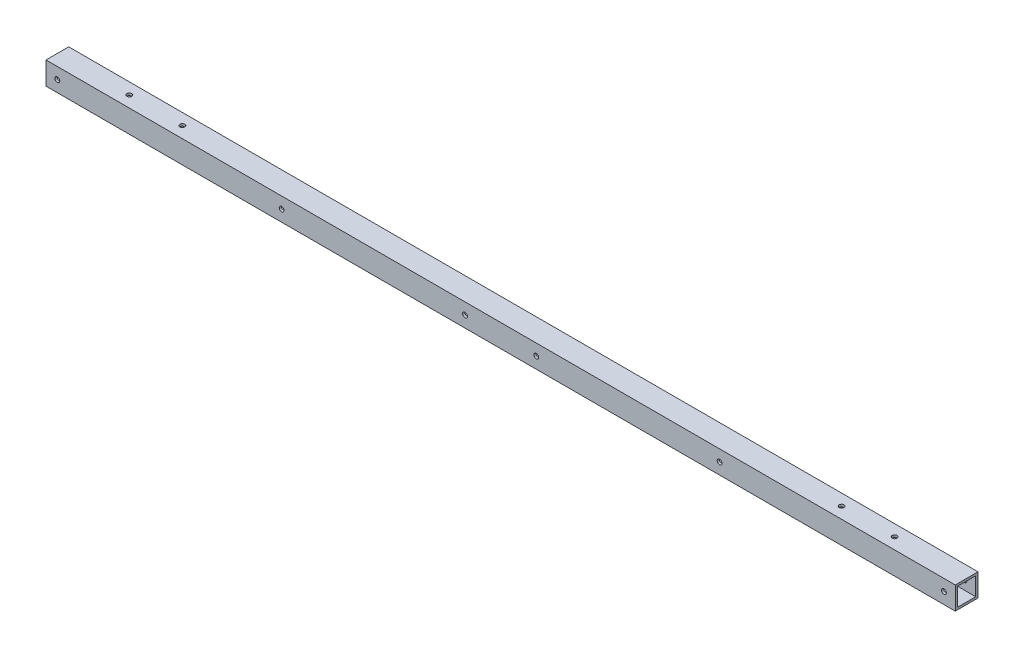
ISO-10303-21;
HEADER;
FILE_DESCRIPTION(('STEP AP214'),'2;1');
FILE_NAME('part.step','',(''),(''),'','','');
FILE_SCHEMA(('AUTOMOTIVE_DESIGN { 1 0 10303 214 1 1 1 1 }'));
ENDSEC;
DATA;
#1=APPLICATION_CONTEXT('core data for automotive mechanical design processes');
#2=APPLICATION_PROTOCOL_DEFINITION('international standard','automotive_design',2000,#1);
#3=PRODUCT_CONTEXT('',#1,'mechanical');
#4=PRODUCT('Part','Part','',(#3));
#5=PRODUCT_RELATED_PRODUCT_CATEGORY('part','',(#4));
#6=PRODUCT_DEFINITION_FORMATION('','',#4);
#7=PRODUCT_DEFINITION_CONTEXT('part definition',#1,'design');
#8=PRODUCT_DEFINITION('design','',#6,#7);
#9=PRODUCT_DEFINITION_SHAPE('','',#8);
#10=(LENGTH_UNIT() NAMED_UNIT(*) SI_UNIT(.MILLI.,.METRE.));
#11=(NAMED_UNIT(*) PLANE_ANGLE_UNIT() SI_UNIT($,.RADIAN.));
#12=(NAMED_UNIT(*) SI_UNIT($,.STERADIAN.) SOLID_ANGLE_UNIT());
#13=UNCERTAINTY_MEASURE_WITH_UNIT(LENGTH_MEASURE(1.E-05),#10,'distance_accuracy_value','');
#14=(GEOMETRIC_REPRESENTATION_CONTEXT(3) GLOBAL_UNCERTAINTY_ASSIGNED_CONTEXT((#13)) GLOBAL_UNIT_ASSIGNED_CONTEXT((#10,
#11,#12)) REPRESENTATION_CONTEXT('',''));
#15=CARTESIAN_POINT('',(0.,0.,0.));
#16=DIRECTION('',(0.,0.,1.));
#17=DIRECTION('',(1.,0.,0.));
#18=AXIS2_PLACEMENT_3D('',#15,#16,#17);
#19=CARTESIAN_POINT('',(7.5,-7.5,15.));
#20=DIRECTION('',(0.,0.,-1.));
#21=DIRECTION('',(-1.,0.,0.));
#22=AXIS2_PLACEMENT_3D('',#19,#20,#21);
#23=CYLINDRICAL_SURFACE('',#22,1.6);
#24=CARTESIAN_POINT('',(7.5,-7.5,13.5));
#25=DIRECTION('',(0.,0.,1.));
#26=DIRECTION('',(1.,0.,0.));
#27=AXIS2_PLACEMENT_3D('',#24,#25,#26);
#28=CIRCLE('',#27,1.6);
#29=CARTESIAN_POINT('',(9.1,-7.5,13.5));
#30=VERTEX_POINT('',#29);
#31=EDGE_CURVE('E165',#30,#30,#28,.T.);
#32=ORIENTED_EDGE('',*,*,#31,.F.);
#33=EDGE_LOOP('',(#32));
#34=FACE_BOUND('',#33,.T.);
#35=CARTESIAN_POINT('',(7.5,-7.5,15.));
#36=DIRECTION('',(0.,0.,1.));
#37=DIRECTION('',(1.,0.,0.));
#38=AXIS2_PLACEMENT_3D('',#35,#36,#37);
#39=CIRCLE('',#38,1.6);
#40=CARTESIAN_POINT('',(9.1,-7.5,15.));
#41=VERTEX_POINT('',#40);
#42=EDGE_CURVE('E187',#41,#41,#39,.T.);
#43=ORIENTED_EDGE('',*,*,#42,.T.);
#44=EDGE_LOOP('',(#43));
#45=FACE_BOUND('',#44,.T.);
#46=ADVANCED_FACE('F43',(#34,#45),#23,.F.);
#47=CARTESIAN_POINT('',(155.5,-7.5,15.));
#48=DIRECTION('',(0.,0.,-1.));
#49=DIRECTION('',(-1.,0.,0.));
#50=AXIS2_PLACEMENT_3D('',#47,#48,#49);
#51=CYLINDRICAL_SURFACE('',#50,1.59999999999999);
#52=CARTESIAN_POINT('',(155.5,-7.5,13.5));
#53=DIRECTION('',(0.,0.,1.));
#54=DIRECTION('',(1.,0.,0.));
#55=AXIS2_PLACEMENT_3D('',#52,#53,#54);
#56=CIRCLE('',#55,1.59999999999999);
#57=CARTESIAN_POINT('',(157.1,-7.5,13.5));
#58=VERTEX_POINT('',#57);
#59=EDGE_CURVE('E162',#58,#58,#56,.T.);
#60=ORIENTED_EDGE('',*,*,#59,.F.);
#61=EDGE_LOOP('',(#60));
#62=FACE_BOUND('',#61,.T.);
#63=CARTESIAN_POINT('',(155.5,-7.5,15.));
#64=DIRECTION('',(0.,0.,1.));
#65=DIRECTION('',(1.,0.,0.));
#66=AXIS2_PLACEMENT_3D('',#63,#64,#65);
#67=CIRCLE('',#66,1.59999999999999);
#68=CARTESIAN_POINT('',(157.1,-7.5,15.));
#69=VERTEX_POINT('',#68);
#70=EDGE_CURVE('E181',#69,#69,#67,.T.);
#71=ORIENTED_EDGE('',*,*,#70,.T.);
#72=EDGE_LOOP('',(#71));
#73=FACE_BOUND('',#72,.T.);
#74=ADVANCED_FACE('F316',(#62,#73),#51,.F.);
#75=CARTESIAN_POINT('',(444.5,-7.5,15.));
#76=DIRECTION('',(0.,0.,-1.));
#77=DIRECTION('',(-1.,0.,0.));
#78=AXIS2_PLACEMENT_3D('',#75,#76,#77);
#79=CYLINDRICAL_SURFACE('',#78,1.59999999999996);
#80=CARTESIAN_POINT('',(444.5,-7.5,13.5));
#81=DIRECTION('',(0.,0.,1.));
#82=DIRECTION('',(1.,0.,0.));
#83=AXIS2_PLACEMENT_3D('',#80,#81,#82);
#84=CIRCLE('',#83,1.59999999999996);
#85=CARTESIAN_POINT('',(446.1,-7.5,13.5));
#86=VERTEX_POINT('',#85);
#87=EDGE_CURVE('E159',#86,#86,#84,.T.);
#88=ORIENTED_EDGE('',*,*,#87,.F.);
#89=EDGE_LOOP('',(#88));
#90=FACE_BOUND('',#89,.T.);
#91=CARTESIAN_POINT('',(444.5,-7.5,15.));
#92=DIRECTION('',(0.,0.,1.));
#93=DIRECTION('',(1.,0.,0.));
#94=AXIS2_PLACEMENT_3D('',#91,#92,#93);
#95=CIRCLE('',#94,1.59999999999996);
#96=CARTESIAN_POINT('',(446.1,-7.5,15.));
#97=VERTEX_POINT('',#96);
#98=EDGE_CURVE('E175',#97,#97,#95,.T.);
#99=ORIENTED_EDGE('',*,*,#98,.T.);
#100=EDGE_LOOP('',(#99));
#101=FACE_BOUND('',#100,.T.);
#102=ADVANCED_FACE('F323',(#90,#101),#79,.F.);
#103=CARTESIAN_POINT('',(592.5,-7.5,15.));
#104=DIRECTION('',(0.,0.,-1.));
#105=DIRECTION('',(-1.,0.,0.));
#106=AXIS2_PLACEMENT_3D('',#103,#104,#105);
#107=CYLINDRICAL_SURFACE('',#106,1.59999999999991);
#108=CARTESIAN_POINT('',(592.5,-7.5,13.5));
#109=DIRECTION('',(0.,0.,1.));
#110=DIRECTION('',(1.,0.,0.));
#111=AXIS2_PLACEMENT_3D('',#108,#109,#110);
#112=CIRCLE('',#111,1.59999999999991);
#113=CARTESIAN_POINT('',(594.1,-7.5,13.5));
#114=VERTEX_POINT('',#113);
#115=EDGE_CURVE('E158',#114,#114,#112,.T.);
#116=ORIENTED_EDGE('',*,*,#115,.F.);
#117=EDGE_LOOP('',(#116));
#118=FACE_BOUND('',#117,.T.);
#119=CARTESIAN_POINT('',(592.5,-7.5,15.));
#120=DIRECTION('',(0.,0.,1.));
#121=DIRECTION('',(1.,0.,0.));
#122=AXIS2_PLACEMENT_3D('',#119,#120,#121);
#123=CIRCLE('',#122,1.59999999999991);
#124=CARTESIAN_POINT('',(594.1,-7.5,15.));
#125=VERTEX_POINT('',#124);
#126=EDGE_CURVE('E169',#125,#125,#123,.T.);
#127=ORIENTED_EDGE('',*,*,#126,.T.);
#128=EDGE_LOOP('',(#127));
#129=FACE_BOUND('',#128,.T.);
#130=ADVANCED_FACE('F362',(#118,#129),#107,.F.);
#131=CARTESIAN_POINT('',(0.,0.,15.));
#132=DIRECTION('',(0.,0.,1.));
#133=DIRECTION('',(1.,0.,0.));
#134=AXIS2_PLACEMENT_3D('',#131,#132,#133);
#135=PLANE('',#134);
#136=CARTESIAN_POINT('',(276.5,-7.49999999999997,15.));
#137=DIRECTION('',(0.,0.,1.));
#138=DIRECTION('',(1.,0.,0.));
#139=AXIS2_PLACEMENT_3D('',#136,#137,#138);
#140=CIRCLE('',#139,1.59999999999996);
#141=CARTESIAN_POINT('',(278.1,-7.49999999999997,15.));
#142=VERTEX_POINT('',#141);
#143=EDGE_CURVE('E246',#142,#142,#140,.T.);
#144=ORIENTED_EDGE('',*,*,#143,.F.);
#145=EDGE_LOOP('',(#144));
#146=FACE_BOUND('',#145,.T.);
#147=CARTESIAN_POINT('',(323.5,-7.49999999999996,15.));
#148=DIRECTION('',(0.,0.,1.));
#149=DIRECTION('',(1.,0.,0.));
#150=AXIS2_PLACEMENT_3D('',#147,#148,#149);
#151=CIRCLE('',#150,1.59999999999996);
#152=CARTESIAN_POINT('',(325.1,-7.49999999999996,15.));
#153=VERTEX_POINT('',#152);
#154=EDGE_CURVE('E251',#153,#153,#151,.T.);
#155=ORIENTED_EDGE('',*,*,#154,.F.);
#156=EDGE_LOOP('',(#155));
#157=FACE_BOUND('',#156,.T.);
#158=ORIENTED_EDGE('',*,*,#98,.F.);
#159=EDGE_LOOP('',(#158));
#160=FACE_BOUND('',#159,.T.);
#161=ORIENTED_EDGE('',*,*,#42,.F.);
#162=EDGE_LOOP('',(#161));
#163=FACE_BOUND('',#162,.T.);
#164=DIRECTION('',(0.,-1.,0.));
#165=VECTOR('',#164,1.);
#166=CARTESIAN_POINT('',(0.,0.,15.));
#167=LINE('',#166,#165);
#168=CARTESIAN_POINT('',(0.,0.,15.));
#169=VERTEX_POINT('',#168);
#170=CARTESIAN_POINT('',(0.,-15.,15.));
#171=VERTEX_POINT('',#170);
#172=EDGE_CURVE('E193',#169,#171,#167,.T.);
#173=ORIENTED_EDGE('',*,*,#172,.T.);
#174=DIRECTION('',(1.,0.,0.));
#175=VECTOR('',#174,1.);
#176=CARTESIAN_POINT('',(0.,-15.,15.));
#177=LINE('',#176,#175);
#178=CARTESIAN_POINT('',(600.,-15.,15.));
#179=VERTEX_POINT('',#178);
#180=EDGE_CURVE('E196',#171,#179,#177,.T.);
#181=ORIENTED_EDGE('',*,*,#180,.T.);
#182=DIRECTION('',(0.,1.,0.));
#183=VECTOR('',#182,1.);
#184=CARTESIAN_POINT('',(600.,0.,15.));
#185=LINE('',#184,#183);
#186=CARTESIAN_POINT('',(600.,0.,15.));
#187=VERTEX_POINT('',#186);
#188=EDGE_CURVE('E199',#179,#187,#185,.T.);
#189=ORIENTED_EDGE('',*,*,#188,.T.);
#190=DIRECTION('',(-1.,0.,0.));
#191=VECTOR('',#190,1.);
#192=CARTESIAN_POINT('',(0.,0.,15.));
#193=LINE('',#192,#191);
#194=EDGE_CURVE('E201',#187,#169,#193,.T.);
#195=ORIENTED_EDGE('',*,*,#194,.T.);
#196=EDGE_LOOP('',(#173,#181,#189,#195));
#197=FACE_BOUND('',#196,.T.);
#198=ORIENTED_EDGE('',*,*,#70,.F.);
#199=EDGE_LOOP('',(#198));
#200=FACE_BOUND('',#199,.T.);
#201=ORIENTED_EDGE('',*,*,#126,.F.);
#202=EDGE_LOOP('',(#201));
#203=FACE_BOUND('',#202,.T.);
#204=ADVANCED_FACE('F350',(#146,#157,#160,#163,#197,#200,#203),#135,.T.);
#205=CARTESIAN_POINT('',(0.,0.,0.));
#206=DIRECTION('',(0.,0.,1.));
#207=DIRECTION('',(1.,0.,0.));
#208=AXIS2_PLACEMENT_3D('',#205,#206,#207);
#209=PLANE('',#208);
#210=CARTESIAN_POINT('',(276.5,-7.49999999999997,0.));
#211=DIRECTION('',(0.,0.,1.));
#212=DIRECTION('',(1.,0.,0.));
#213=AXIS2_PLACEMENT_3D('',#210,#211,#212);
#214=CIRCLE('',#213,1.59999999999996);
#215=CARTESIAN_POINT('',(278.1,-7.49999999999997,0.));
#216=VERTEX_POINT('',#215);
#217=EDGE_CURVE('E240',#216,#216,#214,.T.);
#218=ORIENTED_EDGE('',*,*,#217,.T.);
#219=EDGE_LOOP('',(#218));
#220=FACE_BOUND('',#219,.T.);
#221=CARTESIAN_POINT('',(323.5,-7.49999999999996,0.));
#222=DIRECTION('',(0.,0.,1.));
#223=DIRECTION('',(1.,0.,0.));
#224=AXIS2_PLACEMENT_3D('',#221,#222,#223);
#225=CIRCLE('',#224,1.59999999999996);
#226=CARTESIAN_POINT('',(325.1,-7.49999999999996,0.));
#227=VERTEX_POINT('',#226);
#228=EDGE_CURVE('E256',#227,#227,#225,.T.);
#229=ORIENTED_EDGE('',*,*,#228,.T.);
#230=EDGE_LOOP('',(#229));
#231=FACE_BOUND('',#230,.T.);
#232=DIRECTION('',(0.,-1.,0.));
#233=VECTOR('',#232,1.);
#234=CARTESIAN_POINT('',(0.,0.,0.));
#235=LINE('',#234,#233);
#236=CARTESIAN_POINT('',(0.,0.,0.));
#237=VERTEX_POINT('',#236);
#238=CARTESIAN_POINT('',(0.,-15.,0.));
#239=VERTEX_POINT('',#238);
#240=EDGE_CURVE('E190',#237,#239,#235,.T.);
#241=ORIENTED_EDGE('',*,*,#240,.F.);
#242=DIRECTION('',(-1.,0.,0.));
#243=VECTOR('',#242,1.);
#244=CARTESIAN_POINT('',(0.,0.,0.));
#245=LINE('',#244,#243);
#246=CARTESIAN_POINT('',(600.,0.,0.));
#247=VERTEX_POINT('',#246);
#248=EDGE_CURVE('E197',#247,#237,#245,.T.);
#249=ORIENTED_EDGE('',*,*,#248,.F.);
#250=DIRECTION('',(0.,1.,0.));
#251=VECTOR('',#250,1.);
#252=CARTESIAN_POINT('',(600.,0.,0.));
#253=LINE('',#252,#251);
#254=CARTESIAN_POINT('',(600.,-15.,0.));
#255=VERTEX_POINT('',#254);
#256=EDGE_CURVE('E208',#255,#247,#253,.T.);
#257=ORIENTED_EDGE('',*,*,#256,.F.);
#258=DIRECTION('',(1.,0.,0.));
#259=VECTOR('',#258,1.);
#260=CARTESIAN_POINT('',(0.,-15.,0.));
#261=LINE('',#260,#259);
#262=EDGE_CURVE('E206',#239,#255,#261,.T.);
#263=ORIENTED_EDGE('',*,*,#262,.F.);
#264=EDGE_LOOP('',(#241,#249,#257,#263));
#265=FACE_BOUND('',#264,.T.);
#266=CARTESIAN_POINT('',(7.5,-7.5,0.));
#267=DIRECTION('',(0.,0.,1.));
#268=DIRECTION('',(1.,0.,0.));
#269=AXIS2_PLACEMENT_3D('',#266,#267,#268);
#270=CIRCLE('',#269,1.6);
#271=CARTESIAN_POINT('',(9.1,-7.5,0.));
#272=VERTEX_POINT('',#271);
#273=EDGE_CURVE('E184',#272,#272,#270,.T.);
#274=ORIENTED_EDGE('',*,*,#273,.T.);
#275=EDGE_LOOP('',(#274));
#276=FACE_BOUND('',#275,.T.);
#277=CARTESIAN_POINT('',(155.5,-7.5,0.));
#278=DIRECTION('',(0.,0.,1.));
#279=DIRECTION('',(1.,0.,0.));
#280=AXIS2_PLACEMENT_3D('',#277,#278,#279);
#281=CIRCLE('',#280,1.59999999999999);
#282=CARTESIAN_POINT('',(157.1,-7.5,0.));
#283=VERTEX_POINT('',#282);
#284=EDGE_CURVE('E178',#283,#283,#281,.T.);
#285=ORIENTED_EDGE('',*,*,#284,.T.);
#286=EDGE_LOOP('',(#285));
#287=FACE_BOUND('',#286,.T.);
#288=CARTESIAN_POINT('',(444.5,-7.5,0.));
#289=DIRECTION('',(0.,0.,1.));
#290=DIRECTION('',(1.,0.,0.));
#291=AXIS2_PLACEMENT_3D('',#288,#289,#290);
#292=CIRCLE('',#291,1.59999999999996);
#293=CARTESIAN_POINT('',(446.1,-7.5,0.));
#294=VERTEX_POINT('',#293);
#295=EDGE_CURVE('E172',#294,#294,#292,.T.);
#296=ORIENTED_EDGE('',*,*,#295,.T.);
#297=EDGE_LOOP('',(#296));
#298=FACE_BOUND('',#297,.T.);
#299=CARTESIAN_POINT('',(592.5,-7.5,0.));
#300=DIRECTION('',(0.,0.,1.));
#301=DIRECTION('',(1.,0.,0.));
#302=AXIS2_PLACEMENT_3D('',#299,#300,#301);
#303=CIRCLE('',#302,1.59999999999991);
#304=CARTESIAN_POINT('',(594.1,-7.5,0.));
#305=VERTEX_POINT('',#304);
#306=EDGE_CURVE('E168',#305,#305,#303,.T.);
#307=ORIENTED_EDGE('',*,*,#306,.T.);
#308=EDGE_LOOP('',(#307));
#309=FACE_BOUND('',#308,.T.);
#310=ADVANCED_FACE('F347',(#220,#231,#265,#276,#287,#298,#309),#209,.F.);
#311=CARTESIAN_POINT('',(0.,0.,15.));
#312=DIRECTION('',(1.,0.,0.));
#313=DIRECTION('',(0.,0.,-1.));
#314=AXIS2_PLACEMENT_3D('',#311,#312,#313);
#315=PLANE('',#314);
#316=DIRECTION('',(0.,-1.,0.));
#317=VECTOR('',#316,1.);
#318=CARTESIAN_POINT('',(0.,-1.5,13.5));
#319=LINE('',#318,#317);
#320=CARTESIAN_POINT('',(0.,-1.5,13.5));
#321=VERTEX_POINT('',#320);
#322=CARTESIAN_POINT('',(0.,-13.5,13.5));
#323=VERTEX_POINT('',#322);
#324=EDGE_CURVE('E118',#321,#323,#319,.T.);
#325=ORIENTED_EDGE('',*,*,#324,.T.);
#326=DIRECTION('',(0.,0.,-1.));
#327=VECTOR('',#326,1.);
#328=CARTESIAN_POINT('',(0.,-13.5,13.5));
#329=LINE('',#328,#327);
#330=CARTESIAN_POINT('',(0.,-13.5,1.5));
#331=VERTEX_POINT('',#330);
#332=EDGE_CURVE('E112',#323,#331,#329,.T.);
#333=ORIENTED_EDGE('',*,*,#332,.T.);
#334=DIRECTION('',(0.,1.,0.));
#335=VECTOR('',#334,1.);
#336=CARTESIAN_POINT('',(0.,-13.5,1.5));
#337=LINE('',#336,#335);
#338=CARTESIAN_POINT('',(0.,-1.5,1.5));
#339=VERTEX_POINT('',#338);
#340=EDGE_CURVE('E121',#331,#339,#337,.T.);
#341=ORIENTED_EDGE('',*,*,#340,.T.);
#342=DIRECTION('',(0.,0.,1.));
#343=VECTOR('',#342,1.);
#344=CARTESIAN_POINT('',(0.,-1.5,1.5));
#345=LINE('',#344,#343);
#346=EDGE_CURVE('E60',#339,#321,#345,.T.);
#347=ORIENTED_EDGE('',*,*,#346,.T.);
#348=EDGE_LOOP('',(#325,#333,#341,#347));
#349=FACE_BOUND('',#348,.T.);
#350=ORIENTED_EDGE('',*,*,#240,.T.);
#351=DIRECTION('',(0.,0.,-1.));
#352=VECTOR('',#351,1.);
#353=CARTESIAN_POINT('',(0.,-15.,15.));
#354=LINE('',#353,#352);
#355=EDGE_CURVE('E11',#171,#239,#354,.T.);
#356=ORIENTED_EDGE('',*,*,#355,.F.);
#357=ORIENTED_EDGE('',*,*,#172,.F.);
#358=DIRECTION('',(0.,0.,-1.));
#359=VECTOR('',#358,1.);
#360=CARTESIAN_POINT('',(0.,0.,15.));
#361=LINE('',#360,#359);
#362=EDGE_CURVE('E203',#169,#237,#361,.T.);
#363=ORIENTED_EDGE('',*,*,#362,.T.);
#364=EDGE_LOOP('',(#350,#356,#357,#363));
#365=FACE_BOUND('',#364,.T.);
#366=ADVANCED_FACE('F45',(#349,#365),#315,.F.);
#367=CARTESIAN_POINT('',(0.,-15.,15.));
#368=DIRECTION('',(0.,1.,0.));
#369=DIRECTION('',(0.,0.,1.));
#370=AXIS2_PLACEMENT_3D('',#367,#368,#369);
#371=PLANE('',#370);
#372=CARTESIAN_POINT('',(552.5,-15.,7.5));
#373=DIRECTION('',(0.,-1.,0.));
#374=DIRECTION('',(0.,0.,-1.));
#375=AXIS2_PLACEMENT_3D('',#372,#373,#374);
#376=CIRCLE('',#375,1.60000000000002);
#377=CARTESIAN_POINT('',(552.5,-15.,5.89999999999998));
#378=VERTEX_POINT('',#377);
#379=EDGE_CURVE('E265',#378,#378,#376,.T.);
#380=ORIENTED_EDGE('',*,*,#379,.F.);
#381=EDGE_LOOP('',(#380));
#382=FACE_BOUND('',#381,.T.);
#383=CARTESIAN_POINT('',(82.5,-15.,7.5));
#384=DIRECTION('',(0.,-1.,0.));
#385=DIRECTION('',(0.,0.,-1.));
#386=AXIS2_PLACEMENT_3D('',#383,#384,#385);
#387=CIRCLE('',#386,1.6);
#388=CARTESIAN_POINT('',(82.5,-15.,5.9));
#389=VERTEX_POINT('',#388);
#390=EDGE_CURVE('E269',#389,#389,#387,.T.);
#391=ORIENTED_EDGE('',*,*,#390,.F.);
#392=EDGE_LOOP('',(#391));
#393=FACE_BOUND('',#392,.T.);
#394=CARTESIAN_POINT('',(47.5,-15.,7.5));
#395=DIRECTION('',(0.,-1.,0.));
#396=DIRECTION('',(0.,0.,-1.));
#397=AXIS2_PLACEMENT_3D('',#394,#395,#396);
#398=CIRCLE('',#397,1.6);
#399=CARTESIAN_POINT('',(47.5,-15.,5.9));
#400=VERTEX_POINT('',#399);
#401=EDGE_CURVE('E280',#400,#400,#398,.T.);
#402=ORIENTED_EDGE('',*,*,#401,.F.);
#403=EDGE_LOOP('',(#402));
#404=FACE_BOUND('',#403,.T.);
#405=CARTESIAN_POINT('',(517.5,-15.,7.5));
#406=DIRECTION('',(0.,-1.,0.));
#407=DIRECTION('',(0.,0.,-1.));
#408=AXIS2_PLACEMENT_3D('',#405,#406,#407);
#409=CIRCLE('',#408,1.60000000000002);
#410=CARTESIAN_POINT('',(517.5,-15.,5.89999999999998));
#411=VERTEX_POINT('',#410);
#412=EDGE_CURVE('E268',#411,#411,#409,.T.);
#413=ORIENTED_EDGE('',*,*,#412,.F.);
#414=EDGE_LOOP('',(#413));
#415=FACE_BOUND('',#414,.T.);
#416=ORIENTED_EDGE('',*,*,#262,.T.);
#417=DIRECTION('',(0.,0.,-1.));
#418=VECTOR('',#417,1.);
#419=CARTESIAN_POINT('',(600.,-15.,15.));
#420=LINE('',#419,#418);
#421=EDGE_CURVE('E52',#179,#255,#420,.T.);
#422=ORIENTED_EDGE('',*,*,#421,.F.);
#423=ORIENTED_EDGE('',*,*,#180,.F.);
#424=ORIENTED_EDGE('',*,*,#355,.T.);
#425=EDGE_LOOP('',(#416,#422,#423,#424));
#426=FACE_BOUND('',#425,.T.);
#427=ADVANCED_FACE('F437',(#382,#393,#404,#415,#426),#371,.F.);
#428=CARTESIAN_POINT('',(600.,0.,15.));
#429=DIRECTION('',(-1.,0.,0.));
#430=DIRECTION('',(0.,0.,1.));
#431=AXIS2_PLACEMENT_3D('',#428,#429,#430);
#432=PLANE('',#431);
#433=DIRECTION('',(0.,1.,0.));
#434=VECTOR('',#433,1.);
#435=CARTESIAN_POINT('',(600.,-13.5,1.5));
#436=LINE('',#435,#434);
#437=CARTESIAN_POINT('',(600.,-13.5,1.5));
#438=VERTEX_POINT('',#437);
#439=CARTESIAN_POINT('',(600.,-1.5,1.5));
#440=VERTEX_POINT('',#439);
#441=EDGE_CURVE('E139',#438,#440,#436,.T.);
#442=ORIENTED_EDGE('',*,*,#441,.F.);
#443=DIRECTION('',(0.,0.,-1.));
#444=VECTOR('',#443,1.);
#445=CARTESIAN_POINT('',(600.,-13.5,13.5));
#446=LINE('',#445,#444);
#447=CARTESIAN_POINT('',(600.,-13.5,13.5));
#448=VERTEX_POINT('',#447);
#449=EDGE_CURVE('E68',#448,#438,#446,.T.);
#450=ORIENTED_EDGE('',*,*,#449,.F.);
#451=DIRECTION('',(0.,-1.,0.));
#452=VECTOR('',#451,1.);
#453=CARTESIAN_POINT('',(600.,-1.5,13.5));
#454=LINE('',#453,#452);
#455=CARTESIAN_POINT('',(600.,-1.5,13.5));
#456=VERTEX_POINT('',#455);
#457=EDGE_CURVE('E127',#456,#448,#454,.T.);
#458=ORIENTED_EDGE('',*,*,#457,.F.);
#459=DIRECTION('',(0.,0.,1.));
#460=VECTOR('',#459,1.);
#461=CARTESIAN_POINT('',(600.,-1.5,1.5));
#462=LINE('',#461,#460);
#463=EDGE_CURVE('E130',#440,#456,#462,.T.);
#464=ORIENTED_EDGE('',*,*,#463,.F.);
#465=EDGE_LOOP('',(#442,#450,#458,#464));
#466=FACE_BOUND('',#465,.T.);
#467=ORIENTED_EDGE('',*,*,#256,.T.);
#468=DIRECTION('',(0.,0.,-1.));
#469=VECTOR('',#468,1.);
#470=CARTESIAN_POINT('',(600.,0.,15.));
#471=LINE('',#470,#469);
#472=EDGE_CURVE('E213',#187,#247,#471,.T.);
#473=ORIENTED_EDGE('',*,*,#472,.F.);
#474=ORIENTED_EDGE('',*,*,#188,.F.);
#475=ORIENTED_EDGE('',*,*,#421,.T.);
#476=EDGE_LOOP('',(#467,#473,#474,#475));
#477=FACE_BOUND('',#476,.T.);
#478=ADVANCED_FACE('F340',(#466,#477),#432,.F.);
#479=CARTESIAN_POINT('',(0.,0.,15.));
#480=DIRECTION('',(0.,-1.,0.));
#481=DIRECTION('',(0.,0.,-1.));
#482=AXIS2_PLACEMENT_3D('',#479,#480,#481);
#483=PLANE('',#482);
#484=CARTESIAN_POINT('',(552.5,0.,7.5));
#485=DIRECTION('',(0.,-1.,0.));
#486=DIRECTION('',(0.,0.,-1.));
#487=AXIS2_PLACEMENT_3D('',#484,#485,#486);
#488=CIRCLE('',#487,1.60000000000002);
#489=CARTESIAN_POINT('',(552.5,0.,5.89999999999998));
#490=VERTEX_POINT('',#489);
#491=EDGE_CURVE('E226',#490,#490,#488,.T.);
#492=ORIENTED_EDGE('',*,*,#491,.T.);
#493=EDGE_LOOP('',(#492));
#494=FACE_BOUND('',#493,.T.);
#495=CARTESIAN_POINT('',(82.5,0.,7.5));
#496=DIRECTION('',(0.,-1.,0.));
#497=DIRECTION('',(0.,0.,-1.));
#498=AXIS2_PLACEMENT_3D('',#495,#496,#497);
#499=CIRCLE('',#498,1.6);
#500=CARTESIAN_POINT('',(82.5,0.,5.9));
#501=VERTEX_POINT('',#500);
#502=EDGE_CURVE('E262',#501,#501,#499,.T.);
#503=ORIENTED_EDGE('',*,*,#502,.T.);
#504=EDGE_LOOP('',(#503));
#505=FACE_BOUND('',#504,.T.);
#506=CARTESIAN_POINT('',(47.5,0.,7.5));
#507=DIRECTION('',(0.,-1.,0.));
#508=DIRECTION('',(0.,0.,-1.));
#509=AXIS2_PLACEMENT_3D('',#506,#507,#508);
#510=CIRCLE('',#509,1.6);
#511=CARTESIAN_POINT('',(47.5,0.,5.9));
#512=VERTEX_POINT('',#511);
#513=EDGE_CURVE('E272',#512,#512,#510,.T.);
#514=ORIENTED_EDGE('',*,*,#513,.T.);
#515=EDGE_LOOP('',(#514));
#516=FACE_BOUND('',#515,.T.);
#517=CARTESIAN_POINT('',(517.5,0.,7.5));
#518=DIRECTION('',(0.,-1.,0.));
#519=DIRECTION('',(0.,0.,-1.));
#520=AXIS2_PLACEMENT_3D('',#517,#518,#519);
#521=CIRCLE('',#520,1.60000000000002);
#522=CARTESIAN_POINT('',(517.5,0.,5.89999999999998));
#523=VERTEX_POINT('',#522);
#524=EDGE_CURVE('E277',#523,#523,#521,.T.);
#525=ORIENTED_EDGE('',*,*,#524,.T.);
#526=EDGE_LOOP('',(#525));
#527=FACE_BOUND('',#526,.T.);
#528=ORIENTED_EDGE('',*,*,#248,.T.);
#529=ORIENTED_EDGE('',*,*,#362,.F.);
#530=ORIENTED_EDGE('',*,*,#194,.F.);
#531=ORIENTED_EDGE('',*,*,#472,.T.);
#532=EDGE_LOOP('',(#528,#529,#530,#531));
#533=FACE_BOUND('',#532,.T.);
#534=ADVANCED_FACE('F331',(#494,#505,#516,#527,#533),#483,.F.);
#535=CARTESIAN_POINT('',(7.5,-7.5,1.5));
#536=DIRECTION('',(0.,0.,-1.));
#537=DIRECTION('',(-1.,0.,0.));
#538=AXIS2_PLACEMENT_3D('',#535,#536,#537);
#539=CIRCLE('',#538,1.6);
#540=CARTESIAN_POINT('',(5.9,-7.5,1.5));
#541=VERTEX_POINT('',#540);
#542=EDGE_CURVE('E155',#541,#541,#539,.T.);
#543=ORIENTED_EDGE('',*,*,#542,.F.);
#544=EDGE_LOOP('',(#543));
#545=FACE_BOUND('',#544,.T.);
#546=ORIENTED_EDGE('',*,*,#273,.F.);
#547=EDGE_LOOP('',(#546));
#548=FACE_BOUND('',#547,.T.);
#549=ADVANCED_FACE('F319',(#545,#548),#23,.F.);
#550=CARTESIAN_POINT('',(155.5,-7.5,1.5));
#551=DIRECTION('',(0.,0.,-1.));
#552=DIRECTION('',(-1.,0.,0.));
#553=AXIS2_PLACEMENT_3D('',#550,#551,#552);
#554=CIRCLE('',#553,1.59999999999999);
#555=CARTESIAN_POINT('',(153.9,-7.5,1.5));
#556=VERTEX_POINT('',#555);
#557=EDGE_CURVE('E152',#556,#556,#554,.T.);
#558=ORIENTED_EDGE('',*,*,#557,.F.);
#559=EDGE_LOOP('',(#558));
#560=FACE_BOUND('',#559,.T.);
#561=ORIENTED_EDGE('',*,*,#284,.F.);
#562=EDGE_LOOP('',(#561));
#563=FACE_BOUND('',#562,.T.);
#564=ADVANCED_FACE('F326',(#560,#563),#51,.F.);
#565=CARTESIAN_POINT('',(444.5,-7.5,1.5));
#566=DIRECTION('',(0.,0.,-1.));
#567=DIRECTION('',(-1.,0.,0.));
#568=AXIS2_PLACEMENT_3D('',#565,#566,#567);
#569=CIRCLE('',#568,1.59999999999996);
#570=CARTESIAN_POINT('',(442.9,-7.5,1.5));
#571=VERTEX_POINT('',#570);
#572=EDGE_CURVE('E149',#571,#571,#569,.T.);
#573=ORIENTED_EDGE('',*,*,#572,.F.);
#574=EDGE_LOOP('',(#573));
#575=FACE_BOUND('',#574,.T.);
#576=ORIENTED_EDGE('',*,*,#295,.F.);
#577=EDGE_LOOP('',(#576));
#578=FACE_BOUND('',#577,.T.);
#579=ADVANCED_FACE('F337',(#575,#578),#79,.F.);
#580=CARTESIAN_POINT('',(592.5,-7.5,1.5));
#581=DIRECTION('',(0.,0.,-1.));
#582=DIRECTION('',(-1.,0.,0.));
#583=AXIS2_PLACEMENT_3D('',#580,#581,#582);
#584=CIRCLE('',#583,1.59999999999991);
#585=CARTESIAN_POINT('',(590.9,-7.5,1.5));
#586=VERTEX_POINT('',#585);
#587=EDGE_CURVE('E145',#586,#586,#584,.T.);
#588=ORIENTED_EDGE('',*,*,#587,.F.);
#589=EDGE_LOOP('',(#588));
#590=FACE_BOUND('',#589,.T.);
#591=ORIENTED_EDGE('',*,*,#306,.F.);
#592=EDGE_LOOP('',(#591));
#593=FACE_BOUND('',#592,.T.);
#594=ADVANCED_FACE('F358',(#590,#593),#107,.F.);
#595=CARTESIAN_POINT('',(0.,-13.5,13.5));
#596=DIRECTION('',(0.,-1.,0.));
#597=DIRECTION('',(0.,0.,-1.));
#598=AXIS2_PLACEMENT_3D('',#595,#596,#597);
#599=PLANE('',#598);
#600=CARTESIAN_POINT('',(552.5,-13.5,7.5));
#601=DIRECTION('',(0.,-1.,0.));
#602=DIRECTION('',(0.,0.,-1.));
#603=AXIS2_PLACEMENT_3D('',#600,#601,#602);
#604=CIRCLE('',#603,1.60000000000002);
#605=CARTESIAN_POINT('',(552.5,-13.5,5.89999999999998));
#606=VERTEX_POINT('',#605);
#607=EDGE_CURVE('E133',#606,#606,#604,.T.);
#608=ORIENTED_EDGE('',*,*,#607,.T.);
#609=EDGE_LOOP('',(#608));
#610=FACE_BOUND('',#609,.T.);
#611=CARTESIAN_POINT('',(82.5,-13.5,7.5));
#612=DIRECTION('',(0.,-1.,0.));
#613=DIRECTION('',(0.,0.,-1.));
#614=AXIS2_PLACEMENT_3D('',#611,#612,#613);
#615=CIRCLE('',#614,1.6);
#616=CARTESIAN_POINT('',(82.5,-13.5,5.9));
#617=VERTEX_POINT('',#616);
#618=EDGE_CURVE('E234',#617,#617,#615,.T.);
#619=ORIENTED_EDGE('',*,*,#618,.T.);
#620=EDGE_LOOP('',(#619));
#621=FACE_BOUND('',#620,.T.);
#622=CARTESIAN_POINT('',(47.5,-13.5,7.5));
#623=DIRECTION('',(0.,-1.,0.));
#624=DIRECTION('',(0.,0.,-1.));
#625=AXIS2_PLACEMENT_3D('',#622,#623,#624);
#626=CIRCLE('',#625,1.6);
#627=CARTESIAN_POINT('',(47.5,-13.5,5.9));
#628=VERTEX_POINT('',#627);
#629=EDGE_CURVE('E230',#628,#628,#626,.T.);
#630=ORIENTED_EDGE('',*,*,#629,.T.);
#631=EDGE_LOOP('',(#630));
#632=FACE_BOUND('',#631,.T.);
#633=CARTESIAN_POINT('',(517.5,-13.5,7.5));
#634=DIRECTION('',(0.,-1.,0.));
#635=DIRECTION('',(0.,0.,-1.));
#636=AXIS2_PLACEMENT_3D('',#633,#634,#635);
#637=CIRCLE('',#636,1.60000000000002);
#638=CARTESIAN_POINT('',(517.5,-13.5,5.89999999999998));
#639=VERTEX_POINT('',#638);
#640=EDGE_CURVE('E225',#639,#639,#637,.T.);
#641=ORIENTED_EDGE('',*,*,#640,.T.);
#642=EDGE_LOOP('',(#641));
#643=FACE_BOUND('',#642,.T.);
#644=ORIENTED_EDGE('',*,*,#449,.T.);
#645=DIRECTION('',(1.,0.,0.));
#646=VECTOR('',#645,1.);
#647=CARTESIAN_POINT('',(0.,-13.5,1.5));
#648=LINE('',#647,#646);
#649=EDGE_CURVE('E108',#331,#438,#648,.T.);
#650=ORIENTED_EDGE('',*,*,#649,.F.);
#651=ORIENTED_EDGE('',*,*,#332,.F.);
#652=DIRECTION('',(1.,0.,0.));
#653=VECTOR('',#652,1.);
#654=CARTESIAN_POINT('',(0.,-13.5,13.5));
#655=LINE('',#654,#653);
#656=EDGE_CURVE('E143',#323,#448,#655,.T.);
#657=ORIENTED_EDGE('',*,*,#656,.T.);
#658=EDGE_LOOP('',(#644,#650,#651,#657));
#659=FACE_BOUND('',#658,.T.);
#660=ADVANCED_FACE('F110',(#610,#621,#632,#643,#659),#599,.F.);
#661=CARTESIAN_POINT('',(0.,-1.5,13.5));
#662=DIRECTION('',(0.,0.,1.));
#663=DIRECTION('',(1.,0.,0.));
#664=AXIS2_PLACEMENT_3D('',#661,#662,#663);
#665=PLANE('',#664);
#666=CARTESIAN_POINT('',(276.5,-7.49999999999997,13.5));
#667=DIRECTION('',(0.,0.,1.));
#668=DIRECTION('',(1.,0.,0.));
#669=AXIS2_PLACEMENT_3D('',#666,#667,#668);
#670=CIRCLE('',#669,1.59999999999996);
#671=CARTESIAN_POINT('',(278.1,-7.49999999999997,13.5));
#672=VERTEX_POINT('',#671);
#673=EDGE_CURVE('E259',#672,#672,#670,.T.);
#674=ORIENTED_EDGE('',*,*,#673,.T.);
#675=EDGE_LOOP('',(#674));
#676=FACE_BOUND('',#675,.T.);
#677=CARTESIAN_POINT('',(323.5,-7.49999999999996,13.5));
#678=DIRECTION('',(0.,0.,1.));
#679=DIRECTION('',(1.,0.,0.));
#680=AXIS2_PLACEMENT_3D('',#677,#678,#679);
#681=CIRCLE('',#680,1.59999999999996);
#682=CARTESIAN_POINT('',(325.1,-7.49999999999996,13.5));
#683=VERTEX_POINT('',#682);
#684=EDGE_CURVE('E239',#683,#683,#681,.T.);
#685=ORIENTED_EDGE('',*,*,#684,.T.);
#686=EDGE_LOOP('',(#685));
#687=FACE_BOUND('',#686,.T.);
#688=ORIENTED_EDGE('',*,*,#31,.T.);
#689=EDGE_LOOP('',(#688));
#690=FACE_BOUND('',#689,.T.);
#691=ORIENTED_EDGE('',*,*,#59,.T.);
#692=EDGE_LOOP('',(#691));
#693=FACE_BOUND('',#692,.T.);
#694=ORIENTED_EDGE('',*,*,#87,.T.);
#695=EDGE_LOOP('',(#694));
#696=FACE_BOUND('',#695,.T.);
#697=ORIENTED_EDGE('',*,*,#115,.T.);
#698=EDGE_LOOP('',(#697));
#699=FACE_BOUND('',#698,.T.);
#700=ORIENTED_EDGE('',*,*,#457,.T.);
#701=ORIENTED_EDGE('',*,*,#656,.F.);
#702=ORIENTED_EDGE('',*,*,#324,.F.);
#703=DIRECTION('',(1.,0.,0.));
#704=VECTOR('',#703,1.);
#705=CARTESIAN_POINT('',(0.,-1.5,13.5));
#706=LINE('',#705,#704);
#707=EDGE_CURVE('E146',#321,#456,#706,.T.);
#708=ORIENTED_EDGE('',*,*,#707,.T.);
#709=EDGE_LOOP('',(#700,#701,#702,#708));
#710=FACE_BOUND('',#709,.T.);
#711=ADVANCED_FACE('F368',(#676,#687,#690,#693,#696,#699,#710),#665,.F.);
#712=CARTESIAN_POINT('',(0.,-1.5,1.5));
#713=DIRECTION('',(0.,1.,0.));
#714=DIRECTION('',(0.,0.,1.));
#715=AXIS2_PLACEMENT_3D('',#712,#713,#714);
#716=PLANE('',#715);
#717=CARTESIAN_POINT('',(552.5,-1.5,7.5));
#718=DIRECTION('',(0.,1.,0.));
#719=DIRECTION('',(0.,0.,1.));
#720=AXIS2_PLACEMENT_3D('',#717,#718,#719);
#721=CIRCLE('',#720,1.60000000000002);
#722=CARTESIAN_POINT('',(552.5,-1.5,9.10000000000002));
#723=VERTEX_POINT('',#722);
#724=EDGE_CURVE('E235',#723,#723,#721,.T.);
#725=ORIENTED_EDGE('',*,*,#724,.T.);
#726=EDGE_LOOP('',(#725));
#727=FACE_BOUND('',#726,.T.);
#728=CARTESIAN_POINT('',(82.5,-1.5,7.5));
#729=DIRECTION('',(0.,1.,0.));
#730=DIRECTION('',(0.,0.,1.));
#731=AXIS2_PLACEMENT_3D('',#728,#729,#730);
#732=CIRCLE('',#731,1.6);
#733=CARTESIAN_POINT('',(82.5,-1.5,9.1));
#734=VERTEX_POINT('',#733);
#735=EDGE_CURVE('E231',#734,#734,#732,.T.);
#736=ORIENTED_EDGE('',*,*,#735,.T.);
#737=EDGE_LOOP('',(#736));
#738=FACE_BOUND('',#737,.T.);
#739=CARTESIAN_POINT('',(47.5,-1.5,7.5));
#740=DIRECTION('',(0.,1.,0.));
#741=DIRECTION('',(0.,0.,1.));
#742=AXIS2_PLACEMENT_3D('',#739,#740,#741);
#743=CIRCLE('',#742,1.6);
#744=CARTESIAN_POINT('',(47.5,-1.5,9.1));
#745=VERTEX_POINT('',#744);
#746=EDGE_CURVE('E227',#745,#745,#743,.T.);
#747=ORIENTED_EDGE('',*,*,#746,.T.);
#748=EDGE_LOOP('',(#747));
#749=FACE_BOUND('',#748,.T.);
#750=CARTESIAN_POINT('',(517.5,-1.5,7.5));
#751=DIRECTION('',(0.,1.,0.));
#752=DIRECTION('',(0.,0.,1.));
#753=AXIS2_PLACEMENT_3D('',#750,#751,#752);
#754=CIRCLE('',#753,1.60000000000002);
#755=CARTESIAN_POINT('',(517.5,-1.5,9.10000000000002));
#756=VERTEX_POINT('',#755);
#757=EDGE_CURVE('E222',#756,#756,#754,.T.);
#758=ORIENTED_EDGE('',*,*,#757,.T.);
#759=EDGE_LOOP('',(#758));
#760=FACE_BOUND('',#759,.T.);
#761=ORIENTED_EDGE('',*,*,#463,.T.);
#762=ORIENTED_EDGE('',*,*,#707,.F.);
#763=ORIENTED_EDGE('',*,*,#346,.F.);
#764=DIRECTION('',(1.,0.,0.));
#765=VECTOR('',#764,1.);
#766=CARTESIAN_POINT('',(0.,-1.5,1.5));
#767=LINE('',#766,#765);
#768=EDGE_CURVE('E117',#339,#440,#767,.T.);
#769=ORIENTED_EDGE('',*,*,#768,.T.);
#770=EDGE_LOOP('',(#761,#762,#763,#769));
#771=FACE_BOUND('',#770,.T.);
#772=ADVANCED_FACE('F390',(#727,#738,#749,#760,#771),#716,.F.);
#773=CARTESIAN_POINT('',(0.,-13.5,1.5));
#774=DIRECTION('',(0.,0.,-1.));
#775=DIRECTION('',(-1.,0.,0.));
#776=AXIS2_PLACEMENT_3D('',#773,#774,#775);
#777=PLANE('',#776);
#778=CARTESIAN_POINT('',(276.5,-7.49999999999997,1.5));
#779=DIRECTION('',(0.,0.,-1.));
#780=DIRECTION('',(-1.,0.,0.));
#781=AXIS2_PLACEMENT_3D('',#778,#779,#780);
#782=CIRCLE('',#781,1.59999999999996);
#783=CARTESIAN_POINT('',(274.9,-7.49999999999997,1.5));
#784=VERTEX_POINT('',#783);
#785=EDGE_CURVE('E47',#784,#784,#782,.T.);
#786=ORIENTED_EDGE('',*,*,#785,.T.);
#787=EDGE_LOOP('',(#786));
#788=FACE_BOUND('',#787,.T.);
#789=CARTESIAN_POINT('',(323.5,-7.49999999999996,1.5));
#790=DIRECTION('',(0.,0.,-1.));
#791=DIRECTION('',(-1.,0.,0.));
#792=AXIS2_PLACEMENT_3D('',#789,#790,#791);
#793=CIRCLE('',#792,1.59999999999996);
#794=CARTESIAN_POINT('',(321.9,-7.49999999999996,1.5));
#795=VERTEX_POINT('',#794);
#796=EDGE_CURVE('E237',#795,#795,#793,.T.);
#797=ORIENTED_EDGE('',*,*,#796,.T.);
#798=EDGE_LOOP('',(#797));
#799=FACE_BOUND('',#798,.T.);
#800=ORIENTED_EDGE('',*,*,#542,.T.);
#801=EDGE_LOOP('',(#800));
#802=FACE_BOUND('',#801,.T.);
#803=ORIENTED_EDGE('',*,*,#557,.T.);
#804=EDGE_LOOP('',(#803));
#805=FACE_BOUND('',#804,.T.);
#806=ORIENTED_EDGE('',*,*,#572,.T.);
#807=EDGE_LOOP('',(#806));
#808=FACE_BOUND('',#807,.T.);
#809=ORIENTED_EDGE('',*,*,#587,.T.);
#810=EDGE_LOOP('',(#809));
#811=FACE_BOUND('',#810,.T.);
#812=ORIENTED_EDGE('',*,*,#441,.T.);
#813=ORIENTED_EDGE('',*,*,#768,.F.);
#814=ORIENTED_EDGE('',*,*,#340,.F.);
#815=ORIENTED_EDGE('',*,*,#649,.T.);
#816=EDGE_LOOP('',(#812,#813,#814,#815));
#817=FACE_BOUND('',#816,.T.);
#818=ADVANCED_FACE('F122',(#788,#799,#802,#805,#808,#811,#817),#777,.F.);
#819=CARTESIAN_POINT('',(517.5,0.,7.5));
#820=DIRECTION('',(0.,-1.,0.));
#821=DIRECTION('',(0.,0.,-1.));
#822=AXIS2_PLACEMENT_3D('',#819,#820,#821);
#823=CYLINDRICAL_SURFACE('',#822,1.60000000000002);
#824=ORIENTED_EDGE('',*,*,#524,.F.);
#825=EDGE_LOOP('',(#824));
#826=FACE_BOUND('',#825,.T.);
#827=ORIENTED_EDGE('',*,*,#757,.F.);
#828=EDGE_LOOP('',(#827));
#829=FACE_BOUND('',#828,.T.);
#830=ADVANCED_FACE('F404',(#826,#829),#823,.F.);
#831=CARTESIAN_POINT('',(47.5,0.,7.5));
#832=DIRECTION('',(0.,-1.,0.));
#833=DIRECTION('',(0.,0.,-1.));
#834=AXIS2_PLACEMENT_3D('',#831,#832,#833);
#835=CYLINDRICAL_SURFACE('',#834,1.6);
#836=ORIENTED_EDGE('',*,*,#513,.F.);
#837=EDGE_LOOP('',(#836));
#838=FACE_BOUND('',#837,.T.);
#839=ORIENTED_EDGE('',*,*,#746,.F.);
#840=EDGE_LOOP('',(#839));
#841=FACE_BOUND('',#840,.T.);
#842=ADVANCED_FACE('F311',(#838,#841),#835,.F.);
#843=CARTESIAN_POINT('',(82.5,0.,7.5));
#844=DIRECTION('',(0.,-1.,0.));
#845=DIRECTION('',(0.,0.,-1.));
#846=AXIS2_PLACEMENT_3D('',#843,#844,#845);
#847=CYLINDRICAL_SURFACE('',#846,1.6);
#848=ORIENTED_EDGE('',*,*,#502,.F.);
#849=EDGE_LOOP('',(#848));
#850=FACE_BOUND('',#849,.T.);
#851=ORIENTED_EDGE('',*,*,#735,.F.);
#852=EDGE_LOOP('',(#851));
#853=FACE_BOUND('',#852,.T.);
#854=ADVANCED_FACE('F299',(#850,#853),#847,.F.);
#855=CARTESIAN_POINT('',(552.5,0.,7.5));
#856=DIRECTION('',(0.,-1.,0.));
#857=DIRECTION('',(0.,0.,-1.));
#858=AXIS2_PLACEMENT_3D('',#855,#856,#857);
#859=CYLINDRICAL_SURFACE('',#858,1.60000000000002);
#860=ORIENTED_EDGE('',*,*,#491,.F.);
#861=EDGE_LOOP('',(#860));
#862=FACE_BOUND('',#861,.T.);
#863=ORIENTED_EDGE('',*,*,#724,.F.);
#864=EDGE_LOOP('',(#863));
#865=FACE_BOUND('',#864,.T.);
#866=ADVANCED_FACE('F307',(#862,#865),#859,.F.);
#867=ORIENTED_EDGE('',*,*,#412,.T.);
#868=EDGE_LOOP('',(#867));
#869=FACE_BOUND('',#868,.T.);
#870=ORIENTED_EDGE('',*,*,#640,.F.);
#871=EDGE_LOOP('',(#870));
#872=FACE_BOUND('',#871,.T.);
#873=ADVANCED_FACE('F308',(#869,#872),#823,.F.);
#874=ORIENTED_EDGE('',*,*,#401,.T.);
#875=EDGE_LOOP('',(#874));
#876=FACE_BOUND('',#875,.T.);
#877=ORIENTED_EDGE('',*,*,#629,.F.);
#878=EDGE_LOOP('',(#877));
#879=FACE_BOUND('',#878,.T.);
#880=ADVANCED_FACE('F296',(#876,#879),#835,.F.);
#881=ORIENTED_EDGE('',*,*,#390,.T.);
#882=EDGE_LOOP('',(#881));
#883=FACE_BOUND('',#882,.T.);
#884=ORIENTED_EDGE('',*,*,#618,.F.);
#885=EDGE_LOOP('',(#884));
#886=FACE_BOUND('',#885,.T.);
#887=ADVANCED_FACE('F293',(#883,#886),#847,.F.);
#888=ORIENTED_EDGE('',*,*,#379,.T.);
#889=EDGE_LOOP('',(#888));
#890=FACE_BOUND('',#889,.T.);
#891=ORIENTED_EDGE('',*,*,#607,.F.);
#892=EDGE_LOOP('',(#891));
#893=FACE_BOUND('',#892,.T.);
#894=ADVANCED_FACE('F295',(#890,#893),#859,.F.);
#895=CARTESIAN_POINT('',(323.5,-7.49999999999996,0.));
#896=DIRECTION('',(0.,0.,1.));
#897=DIRECTION('',(1.,0.,0.));
#898=AXIS2_PLACEMENT_3D('',#895,#896,#897);
#899=CYLINDRICAL_SURFACE('',#898,1.59999999999996);
#900=ORIENTED_EDGE('',*,*,#228,.F.);
#901=EDGE_LOOP('',(#900));
#902=FACE_BOUND('',#901,.T.);
#903=ORIENTED_EDGE('',*,*,#796,.F.);
#904=EDGE_LOOP('',(#903));
#905=FACE_BOUND('',#904,.T.);
#906=ADVANCED_FACE('F304',(#902,#905),#899,.F.);
#907=CARTESIAN_POINT('',(276.5,-7.49999999999997,0.));
#908=DIRECTION('',(0.,0.,1.));
#909=DIRECTION('',(1.,0.,0.));
#910=AXIS2_PLACEMENT_3D('',#907,#908,#909);
#911=CYLINDRICAL_SURFACE('',#910,1.59999999999996);
#912=ORIENTED_EDGE('',*,*,#217,.F.);
#913=EDGE_LOOP('',(#912));
#914=FACE_BOUND('',#913,.T.);
#915=ORIENTED_EDGE('',*,*,#785,.F.);
#916=EDGE_LOOP('',(#915));
#917=FACE_BOUND('',#916,.T.);
#918=ADVANCED_FACE('F594',(#914,#917),#911,.F.);
#919=ORIENTED_EDGE('',*,*,#154,.T.);
#920=EDGE_LOOP('',(#919));
#921=FACE_BOUND('',#920,.T.);
#922=ORIENTED_EDGE('',*,*,#684,.F.);
#923=EDGE_LOOP('',(#922));
#924=FACE_BOUND('',#923,.T.);
#925=ADVANCED_FACE('F597',(#921,#924),#899,.F.);
#926=ORIENTED_EDGE('',*,*,#143,.T.);
#927=EDGE_LOOP('',(#926));
#928=FACE_BOUND('',#927,.T.);
#929=ORIENTED_EDGE('',*,*,#673,.F.);
#930=EDGE_LOOP('',(#929));
#931=FACE_BOUND('',#930,.T.);
#932=ADVANCED_FACE('F607',(#928,#931),#911,.F.);
#933=CLOSED_SHELL('',(#46,#74,#102,#130,#204,#310,#366,#427,#478,#534,#549,#564,#579,#594,#660,
#711,#772,#818,#830,#842,#854,#866,#873,#880,#887,#894,#906,#918,#925,#932));
#934=MANIFOLD_SOLID_BREP('B2',#933);
#935=ADVANCED_BREP_SHAPE_REPRESENTATION('',(#18,#934),#14);
#936=SHAPE_DEFINITION_REPRESENTATION(#9,#935);
ENDSEC;
END-ISO-10303-21;
